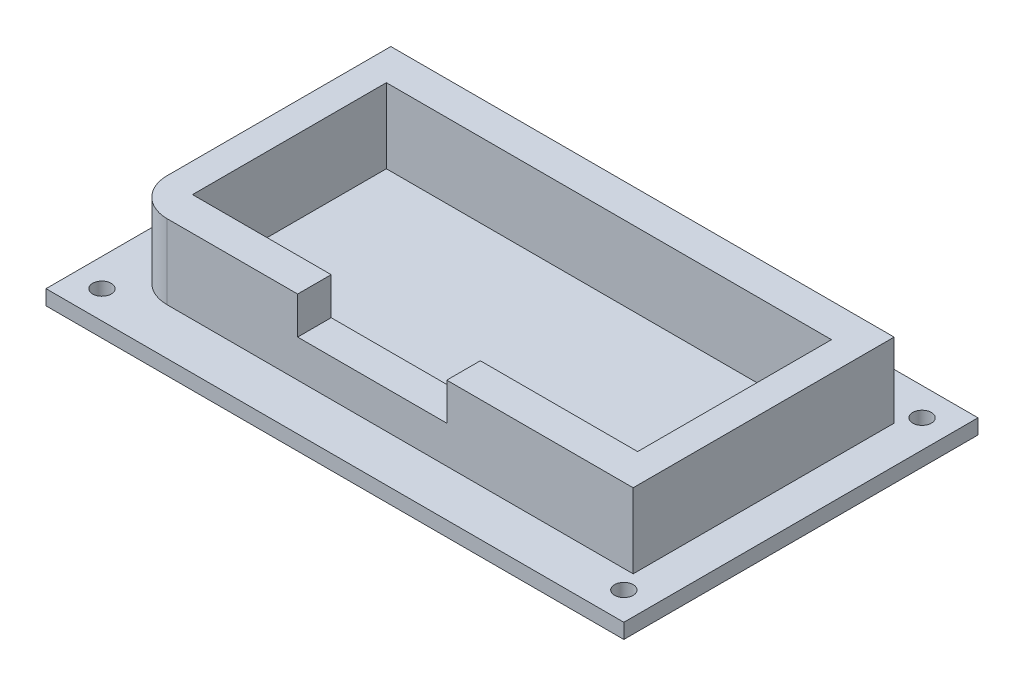
ISO-10303-21;
HEADER;
FILE_DESCRIPTION(('STEP AP214'),'2;1');
FILE_NAME('part.step','',(''),(''),'','','');
FILE_SCHEMA(('AUTOMOTIVE_DESIGN { 1 0 10303 214 1 1 1 1 }'));
ENDSEC;
DATA;
#1=APPLICATION_CONTEXT('core data for automotive mechanical design processes');
#2=APPLICATION_PROTOCOL_DEFINITION('international standard','automotive_design',2000,#1);
#3=PRODUCT_CONTEXT('',#1,'mechanical');
#4=PRODUCT('Part','Part','',(#3));
#5=PRODUCT_RELATED_PRODUCT_CATEGORY('part','',(#4));
#6=PRODUCT_DEFINITION_FORMATION('','',#4);
#7=PRODUCT_DEFINITION_CONTEXT('part definition',#1,'design');
#8=PRODUCT_DEFINITION('design','',#6,#7);
#9=PRODUCT_DEFINITION_SHAPE('','',#8);
#10=(LENGTH_UNIT() NAMED_UNIT(*) SI_UNIT(.MILLI.,.METRE.));
#11=(NAMED_UNIT(*) PLANE_ANGLE_UNIT() SI_UNIT($,.RADIAN.));
#12=(NAMED_UNIT(*) SI_UNIT($,.STERADIAN.) SOLID_ANGLE_UNIT());
#13=UNCERTAINTY_MEASURE_WITH_UNIT(LENGTH_MEASURE(1.E-05),#10,'distance_accuracy_value','');
#14=(GEOMETRIC_REPRESENTATION_CONTEXT(3) GLOBAL_UNCERTAINTY_ASSIGNED_CONTEXT((#13)) GLOBAL_UNIT_ASSIGNED_CONTEXT((#10,
#11,#12)) REPRESENTATION_CONTEXT('',''));
#15=CARTESIAN_POINT('',(0.,0.,0.));
#16=DIRECTION('',(0.,0.,1.));
#17=DIRECTION('',(1.,0.,0.));
#18=AXIS2_PLACEMENT_3D('',#15,#16,#17);
#19=CARTESIAN_POINT('',(-73.025,30.48,31.75));
#20=DIRECTION('',(0.,-1.,0.));
#21=DIRECTION('',(0.,0.,-1.));
#22=AXIS2_PLACEMENT_3D('',#19,#20,#21);
#23=CYLINDRICAL_SURFACE('',#22,12.7);
#24=DIRECTION('',(0.,-1.,0.));
#25=VECTOR('',#24,1.);
#26=CARTESIAN_POINT('',(-73.025,30.48,44.45));
#27=LINE('',#26,#25);
#28=CARTESIAN_POINT('',(-73.025,30.48,44.45));
#29=VERTEX_POINT('',#28);
#30=CARTESIAN_POINT('',(-73.025,5.08,44.45));
#31=VERTEX_POINT('',#30);
#32=EDGE_CURVE('E257',#29,#31,#27,.T.);
#33=ORIENTED_EDGE('',*,*,#32,.F.);
#34=CARTESIAN_POINT('',(-73.025,30.48,31.75));
#35=DIRECTION('',(0.,-1.,0.));
#36=DIRECTION('',(0.,0.,-1.));
#37=AXIS2_PLACEMENT_3D('',#34,#35,#36);
#38=CIRCLE('',#37,12.7);
#39=CARTESIAN_POINT('',(-85.725,30.48,31.75));
#40=VERTEX_POINT('',#39);
#41=EDGE_CURVE('E40',#40,#29,#38,.F.);
#42=ORIENTED_EDGE('',*,*,#41,.F.);
#43=DIRECTION('',(0.,-1.,0.));
#44=VECTOR('',#43,1.);
#45=CARTESIAN_POINT('',(-85.725,30.48,31.75));
#46=LINE('',#45,#44);
#47=CARTESIAN_POINT('',(-85.725,5.08,31.75));
#48=VERTEX_POINT('',#47);
#49=EDGE_CURVE('E259',#48,#40,#46,.F.);
#50=ORIENTED_EDGE('',*,*,#49,.F.);
#51=CARTESIAN_POINT('',(-73.025,5.08,31.75));
#52=DIRECTION('',(0.,1.,0.));
#53=DIRECTION('',(0.,0.,1.));
#54=AXIS2_PLACEMENT_3D('',#51,#52,#53);
#55=CIRCLE('',#54,12.7);
#56=EDGE_CURVE('E11',#48,#31,#55,.T.);
#57=ORIENTED_EDGE('',*,*,#56,.T.);
#58=EDGE_LOOP('',(#33,#42,#50,#57));
#59=FACE_BOUND('',#58,.T.);
#60=ADVANCED_FACE('F33',(#59),#23,.T.);
#61=CARTESIAN_POINT('',(0.,5.08,0.));
#62=DIRECTION('',(0.,1.,0.));
#63=DIRECTION('',(0.,0.,1.));
#64=AXIS2_PLACEMENT_3D('',#61,#62,#63);
#65=PLANE('',#64);
#66=DIRECTION('',(0.,0.,-1.));
#67=VECTOR('',#66,1.);
#68=CARTESIAN_POINT('',(-98.425,5.08,0.));
#69=LINE('',#68,#67);
#70=CARTESIAN_POINT('',(-98.425,5.08,60.325));
#71=VERTEX_POINT('',#70);
#72=CARTESIAN_POINT('',(-98.425,5.08,-60.325));
#73=VERTEX_POINT('',#72);
#74=EDGE_CURVE('E215',#71,#73,#69,.T.);
#75=ORIENTED_EDGE('',*,*,#74,.F.);
#76=DIRECTION('',(-1.,0.,0.));
#77=VECTOR('',#76,1.);
#78=CARTESIAN_POINT('',(0.,5.08,60.325));
#79=LINE('',#78,#77);
#80=CARTESIAN_POINT('',(98.425,5.08,60.325));
#81=VERTEX_POINT('',#80);
#82=EDGE_CURVE('E218',#81,#71,#79,.T.);
#83=ORIENTED_EDGE('',*,*,#82,.F.);
#84=DIRECTION('',(0.,0.,-1.));
#85=VECTOR('',#84,1.);
#86=CARTESIAN_POINT('',(98.425,5.08,0.));
#87=LINE('',#86,#85);
#88=CARTESIAN_POINT('',(98.425,5.08,-60.325));
#89=VERTEX_POINT('',#88);
#90=EDGE_CURVE('E221',#81,#89,#87,.T.);
#91=ORIENTED_EDGE('',*,*,#90,.T.);
#92=DIRECTION('',(-1.,0.,0.));
#93=VECTOR('',#92,1.);
#94=CARTESIAN_POINT('',(0.,5.08,-60.325));
#95=LINE('',#94,#93);
#96=EDGE_CURVE('E224',#89,#73,#95,.T.);
#97=ORIENTED_EDGE('',*,*,#96,.T.);
#98=EDGE_LOOP('',(#75,#83,#91,#97));
#99=FACE_BOUND('',#98,.T.);
#100=CARTESIAN_POINT('',(88.9,5.08,50.8));
#101=DIRECTION('',(0.,1.,0.));
#102=DIRECTION('',(0.,0.,1.));
#103=AXIS2_PLACEMENT_3D('',#100,#101,#102);
#104=CIRCLE('',#103,3.17500000000002);
#105=CARTESIAN_POINT('',(88.9,5.08,53.975));
#106=VERTEX_POINT('',#105);
#107=EDGE_CURVE('E212',#106,#106,#104,.F.);
#108=ORIENTED_EDGE('',*,*,#107,.T.);
#109=EDGE_LOOP('',(#108));
#110=FACE_BOUND('',#109,.T.);
#111=CARTESIAN_POINT('',(-88.9,5.08,-50.8));
#112=DIRECTION('',(0.,1.,0.));
#113=DIRECTION('',(0.,0.,1.));
#114=AXIS2_PLACEMENT_3D('',#111,#112,#113);
#115=CIRCLE('',#114,3.175);
#116=CARTESIAN_POINT('',(-88.9,5.08,-47.625));
#117=VERTEX_POINT('',#116);
#118=EDGE_CURVE('E209',#117,#117,#115,.F.);
#119=ORIENTED_EDGE('',*,*,#118,.T.);
#120=EDGE_LOOP('',(#119));
#121=FACE_BOUND('',#120,.T.);
#122=CARTESIAN_POINT('',(-88.9,5.08,50.8));
#123=DIRECTION('',(0.,1.,0.));
#124=DIRECTION('',(0.,0.,1.));
#125=AXIS2_PLACEMENT_3D('',#122,#123,#124);
#126=CIRCLE('',#125,3.175);
#127=CARTESIAN_POINT('',(-88.9,5.08,53.975));
#128=VERTEX_POINT('',#127);
#129=EDGE_CURVE('E205',#128,#128,#126,.T.);
#130=ORIENTED_EDGE('',*,*,#129,.F.);
#131=EDGE_LOOP('',(#130));
#132=FACE_BOUND('',#131,.T.);
#133=CARTESIAN_POINT('',(88.9,5.08,-50.8));
#134=DIRECTION('',(0.,1.,0.));
#135=DIRECTION('',(0.,0.,1.));
#136=AXIS2_PLACEMENT_3D('',#133,#134,#135);
#137=CIRCLE('',#136,3.175);
#138=CARTESIAN_POINT('',(88.9,5.08,-47.625));
#139=VERTEX_POINT('',#138);
#140=EDGE_CURVE('E202',#139,#139,#137,.T.);
#141=ORIENTED_EDGE('',*,*,#140,.F.);
#142=EDGE_LOOP('',(#141));
#143=FACE_BOUND('',#142,.T.);
#144=DIRECTION('',(-1.,0.,0.));
#145=VECTOR('',#144,1.);
#146=CARTESIAN_POINT('',(-85.725,5.08,-44.45));
#147=LINE('',#146,#145);
#148=CARTESIAN_POINT('',(85.725,5.08,-44.45));
#149=VERTEX_POINT('',#148);
#150=CARTESIAN_POINT('',(-85.725,5.08,-44.45));
#151=VERTEX_POINT('',#150);
#152=EDGE_CURVE('E188',#149,#151,#147,.T.);
#153=ORIENTED_EDGE('',*,*,#152,.F.);
#154=DIRECTION('',(0.,0.,-1.));
#155=VECTOR('',#154,1.);
#156=CARTESIAN_POINT('',(85.725,5.08,44.45));
#157=LINE('',#156,#155);
#158=CARTESIAN_POINT('',(85.725,5.08,44.45));
#159=VERTEX_POINT('',#158);
#160=EDGE_CURVE('E185',#159,#149,#157,.T.);
#161=ORIENTED_EDGE('',*,*,#160,.F.);
#162=DIRECTION('',(1.,0.,0.));
#163=VECTOR('',#162,1.);
#164=CARTESIAN_POINT('',(-85.725,5.08,44.45));
#165=LINE('',#164,#163);
#166=EDGE_CURVE('E194',#31,#159,#165,.T.);
#167=ORIENTED_EDGE('',*,*,#166,.F.);
#168=ORIENTED_EDGE('',*,*,#56,.F.);
#169=DIRECTION('',(0.,0.,1.));
#170=VECTOR('',#169,1.);
#171=CARTESIAN_POINT('',(-85.725,5.08,44.45));
#172=LINE('',#171,#170);
#173=EDGE_CURVE('E191',#151,#48,#172,.T.);
#174=ORIENTED_EDGE('',*,*,#173,.F.);
#175=EDGE_LOOP('',(#153,#161,#167,#168,#174));
#176=FACE_BOUND('',#175,.T.);
#177=ADVANCED_FACE('F325',(#99,#110,#121,#132,#143,#176),#65,.T.);
#178=CARTESIAN_POINT('',(-98.425,5.08,0.));
#179=DIRECTION('',(-1.,0.,0.));
#180=DIRECTION('',(0.,0.,1.));
#181=AXIS2_PLACEMENT_3D('',#178,#179,#180);
#182=PLANE('',#181);
#183=DIRECTION('',(0.,0.,-1.));
#184=VECTOR('',#183,1.);
#185=CARTESIAN_POINT('',(-98.425,0.,0.));
#186=LINE('',#185,#184);
#187=CARTESIAN_POINT('',(-98.425,0.,60.325));
#188=VERTEX_POINT('',#187);
#189=CARTESIAN_POINT('',(-98.425,0.,-60.325));
#190=VERTEX_POINT('',#189);
#191=EDGE_CURVE('E238',#188,#190,#186,.T.);
#192=ORIENTED_EDGE('',*,*,#191,.F.);
#193=DIRECTION('',(0.,-1.,0.));
#194=VECTOR('',#193,1.);
#195=CARTESIAN_POINT('',(-98.425,5.08,60.325));
#196=LINE('',#195,#194);
#197=EDGE_CURVE('E255',#71,#188,#196,.T.);
#198=ORIENTED_EDGE('',*,*,#197,.F.);
#199=ORIENTED_EDGE('',*,*,#74,.T.);
#200=DIRECTION('',(0.,-1.,0.));
#201=VECTOR('',#200,1.);
#202=CARTESIAN_POINT('',(-98.425,5.08,-60.325));
#203=LINE('',#202,#201);
#204=EDGE_CURVE('E226',#73,#190,#203,.T.);
#205=ORIENTED_EDGE('',*,*,#204,.T.);
#206=EDGE_LOOP('',(#192,#198,#199,#205));
#207=FACE_BOUND('',#206,.T.);
#208=ADVANCED_FACE('F330',(#207),#182,.T.);
#209=CARTESIAN_POINT('',(0.,5.08,60.325));
#210=DIRECTION('',(0.,0.,1.));
#211=DIRECTION('',(1.,0.,0.));
#212=AXIS2_PLACEMENT_3D('',#209,#210,#211);
#213=PLANE('',#212);
#214=DIRECTION('',(-1.,0.,0.));
#215=VECTOR('',#214,1.);
#216=CARTESIAN_POINT('',(0.,0.,60.325));
#217=LINE('',#216,#215);
#218=CARTESIAN_POINT('',(98.425,0.,60.325));
#219=VERTEX_POINT('',#218);
#220=EDGE_CURVE('E241',#219,#188,#217,.T.);
#221=ORIENTED_EDGE('',*,*,#220,.F.);
#222=DIRECTION('',(0.,-1.,0.));
#223=VECTOR('',#222,1.);
#224=CARTESIAN_POINT('',(98.425,5.08,60.325));
#225=LINE('',#224,#223);
#226=EDGE_CURVE('E253',#81,#219,#225,.T.);
#227=ORIENTED_EDGE('',*,*,#226,.F.);
#228=ORIENTED_EDGE('',*,*,#82,.T.);
#229=ORIENTED_EDGE('',*,*,#197,.T.);
#230=EDGE_LOOP('',(#221,#227,#228,#229));
#231=FACE_BOUND('',#230,.T.);
#232=ADVANCED_FACE('F337',(#231),#213,.T.);
#233=CARTESIAN_POINT('',(98.425,5.08,0.));
#234=DIRECTION('',(-1.,0.,0.));
#235=DIRECTION('',(0.,0.,1.));
#236=AXIS2_PLACEMENT_3D('',#233,#234,#235);
#237=PLANE('',#236);
#238=DIRECTION('',(0.,0.,-1.));
#239=VECTOR('',#238,1.);
#240=CARTESIAN_POINT('',(98.425,0.,0.));
#241=LINE('',#240,#239);
#242=CARTESIAN_POINT('',(98.425,0.,-60.325));
#243=VERTEX_POINT('',#242);
#244=EDGE_CURVE('E244',#219,#243,#241,.T.);
#245=ORIENTED_EDGE('',*,*,#244,.T.);
#246=DIRECTION('',(0.,-1.,0.));
#247=VECTOR('',#246,1.);
#248=CARTESIAN_POINT('',(98.425,5.08,-60.325));
#249=LINE('',#248,#247);
#250=EDGE_CURVE('E250',#89,#243,#249,.T.);
#251=ORIENTED_EDGE('',*,*,#250,.F.);
#252=ORIENTED_EDGE('',*,*,#90,.F.);
#253=ORIENTED_EDGE('',*,*,#226,.T.);
#254=EDGE_LOOP('',(#245,#251,#252,#253));
#255=FACE_BOUND('',#254,.T.);
#256=ADVANCED_FACE('F522',(#255),#237,.F.);
#257=CARTESIAN_POINT('',(88.9,5.08,50.8));
#258=DIRECTION('',(0.,-1.,0.));
#259=DIRECTION('',(0.,0.,-1.));
#260=AXIS2_PLACEMENT_3D('',#257,#258,#259);
#261=CYLINDRICAL_SURFACE('',#260,3.17500000000002);
#262=ORIENTED_EDGE('',*,*,#107,.F.);
#263=EDGE_LOOP('',(#262));
#264=FACE_BOUND('',#263,.T.);
#265=CARTESIAN_POINT('',(88.9,0.,50.8));
#266=DIRECTION('',(0.,1.,0.));
#267=DIRECTION('',(0.,0.,1.));
#268=AXIS2_PLACEMENT_3D('',#265,#266,#267);
#269=CIRCLE('',#268,3.17500000000002);
#270=CARTESIAN_POINT('',(88.9,0.,53.975));
#271=VERTEX_POINT('',#270);
#272=EDGE_CURVE('E235',#271,#271,#269,.F.);
#273=ORIENTED_EDGE('',*,*,#272,.T.);
#274=EDGE_LOOP('',(#273));
#275=FACE_BOUND('',#274,.T.);
#276=ADVANCED_FACE('F512',(#264,#275),#261,.F.);
#277=CARTESIAN_POINT('',(-88.9,5.08,-50.8));
#278=DIRECTION('',(0.,-1.,0.));
#279=DIRECTION('',(0.,0.,-1.));
#280=AXIS2_PLACEMENT_3D('',#277,#278,#279);
#281=CYLINDRICAL_SURFACE('',#280,3.175);
#282=ORIENTED_EDGE('',*,*,#118,.F.);
#283=EDGE_LOOP('',(#282));
#284=FACE_BOUND('',#283,.T.);
#285=CARTESIAN_POINT('',(-88.9,0.,-50.8));
#286=DIRECTION('',(0.,1.,0.));
#287=DIRECTION('',(0.,0.,1.));
#288=AXIS2_PLACEMENT_3D('',#285,#286,#287);
#289=CIRCLE('',#288,3.175);
#290=CARTESIAN_POINT('',(-88.9,0.,-47.625));
#291=VERTEX_POINT('',#290);
#292=EDGE_CURVE('E232',#291,#291,#289,.F.);
#293=ORIENTED_EDGE('',*,*,#292,.T.);
#294=EDGE_LOOP('',(#293));
#295=FACE_BOUND('',#294,.T.);
#296=ADVANCED_FACE('F502',(#284,#295),#281,.F.);
#297=CARTESIAN_POINT('',(-88.9,5.08,50.8));
#298=DIRECTION('',(0.,-1.,0.));
#299=DIRECTION('',(0.,0.,-1.));
#300=AXIS2_PLACEMENT_3D('',#297,#298,#299);
#301=CYLINDRICAL_SURFACE('',#300,3.175);
#302=ORIENTED_EDGE('',*,*,#129,.T.);
#303=EDGE_LOOP('',(#302));
#304=FACE_BOUND('',#303,.T.);
#305=CARTESIAN_POINT('',(-88.9,0.,50.8));
#306=DIRECTION('',(0.,1.,0.));
#307=DIRECTION('',(0.,0.,1.));
#308=AXIS2_PLACEMENT_3D('',#305,#306,#307);
#309=CIRCLE('',#308,3.175);
#310=CARTESIAN_POINT('',(-88.9,0.,53.975));
#311=VERTEX_POINT('',#310);
#312=EDGE_CURVE('E229',#311,#311,#309,.T.);
#313=ORIENTED_EDGE('',*,*,#312,.F.);
#314=EDGE_LOOP('',(#313));
#315=FACE_BOUND('',#314,.T.);
#316=ADVANCED_FACE('F493',(#304,#315),#301,.F.);
#317=CARTESIAN_POINT('',(88.9,5.08,-50.8));
#318=DIRECTION('',(0.,-1.,0.));
#319=DIRECTION('',(0.,0.,-1.));
#320=AXIS2_PLACEMENT_3D('',#317,#318,#319);
#321=CYLINDRICAL_SURFACE('',#320,3.175);
#322=ORIENTED_EDGE('',*,*,#140,.T.);
#323=EDGE_LOOP('',(#322));
#324=FACE_BOUND('',#323,.T.);
#325=CARTESIAN_POINT('',(88.9,0.,-50.8));
#326=DIRECTION('',(0.,1.,0.));
#327=DIRECTION('',(0.,0.,1.));
#328=AXIS2_PLACEMENT_3D('',#325,#326,#327);
#329=CIRCLE('',#328,3.175);
#330=CARTESIAN_POINT('',(88.9,0.,-47.625));
#331=VERTEX_POINT('',#330);
#332=EDGE_CURVE('E201',#331,#331,#329,.T.);
#333=ORIENTED_EDGE('',*,*,#332,.F.);
#334=EDGE_LOOP('',(#333));
#335=FACE_BOUND('',#334,.T.);
#336=ADVANCED_FACE('F483',(#324,#335),#321,.F.);
#337=CARTESIAN_POINT('',(0.,5.08,-60.325));
#338=DIRECTION('',(0.,0.,1.));
#339=DIRECTION('',(1.,0.,0.));
#340=AXIS2_PLACEMENT_3D('',#337,#338,#339);
#341=PLANE('',#340);
#342=DIRECTION('',(-1.,0.,0.));
#343=VECTOR('',#342,1.);
#344=CARTESIAN_POINT('',(0.,0.,-60.325));
#345=LINE('',#344,#343);
#346=EDGE_CURVE('E206',#243,#190,#345,.T.);
#347=ORIENTED_EDGE('',*,*,#346,.T.);
#348=ORIENTED_EDGE('',*,*,#204,.F.);
#349=ORIENTED_EDGE('',*,*,#96,.F.);
#350=ORIENTED_EDGE('',*,*,#250,.T.);
#351=EDGE_LOOP('',(#347,#348,#349,#350));
#352=FACE_BOUND('',#351,.T.);
#353=ADVANCED_FACE('F472',(#352),#341,.F.);
#354=CARTESIAN_POINT('',(0.,0.,0.));
#355=DIRECTION('',(0.,1.,0.));
#356=DIRECTION('',(0.,0.,1.));
#357=AXIS2_PLACEMENT_3D('',#354,#355,#356);
#358=PLANE('',#357);
#359=ORIENTED_EDGE('',*,*,#332,.T.);
#360=EDGE_LOOP('',(#359));
#361=FACE_BOUND('',#360,.T.);
#362=ORIENTED_EDGE('',*,*,#312,.T.);
#363=EDGE_LOOP('',(#362));
#364=FACE_BOUND('',#363,.T.);
#365=ORIENTED_EDGE('',*,*,#292,.F.);
#366=EDGE_LOOP('',(#365));
#367=FACE_BOUND('',#366,.T.);
#368=ORIENTED_EDGE('',*,*,#272,.F.);
#369=EDGE_LOOP('',(#368));
#370=FACE_BOUND('',#369,.T.);
#371=ORIENTED_EDGE('',*,*,#191,.T.);
#372=ORIENTED_EDGE('',*,*,#346,.F.);
#373=ORIENTED_EDGE('',*,*,#244,.F.);
#374=ORIENTED_EDGE('',*,*,#220,.T.);
#375=EDGE_LOOP('',(#371,#372,#373,#374));
#376=FACE_BOUND('',#375,.T.);
#377=ADVANCED_FACE('F387',(#361,#364,#367,#370,#376),#358,.F.);
#378=CARTESIAN_POINT('',(0.,30.48,0.));
#379=DIRECTION('',(0.,-1.,0.));
#380=DIRECTION('',(0.,0.,-1.));
#381=AXIS2_PLACEMENT_3D('',#378,#379,#380);
#382=PLANE('',#381);
#383=DIRECTION('',(1.,0.,0.));
#384=VECTOR('',#383,1.);
#385=CARTESIAN_POINT('',(-85.725,30.48,44.45));
#386=LINE('',#385,#384);
#387=CARTESIAN_POINT('',(-28.5769865469619,30.48,44.45));
#388=VERTEX_POINT('',#387);
#389=EDGE_CURVE('E168',#29,#388,#386,.T.);
#390=ORIENTED_EDGE('',*,*,#389,.T.);
#391=DIRECTION('',(0.,0.,-1.));
#392=VECTOR('',#391,1.);
#393=CARTESIAN_POINT('',(-28.5769865469619,30.48,60.326));
#394=LINE('',#393,#392);
#395=CARTESIAN_POINT('',(-28.5769865469619,30.48,33.02));
#396=VERTEX_POINT('',#395);
#397=EDGE_CURVE('E151',#388,#396,#394,.T.);
#398=ORIENTED_EDGE('',*,*,#397,.T.);
#399=DIRECTION('',(1.,0.,0.));
#400=VECTOR('',#399,1.);
#401=CARTESIAN_POINT('',(75.819,30.48,33.02));
#402=LINE('',#401,#400);
#403=CARTESIAN_POINT('',(-75.819,30.48,33.02));
#404=VERTEX_POINT('',#403);
#405=EDGE_CURVE('E295',#404,#396,#402,.T.);
#406=ORIENTED_EDGE('',*,*,#405,.F.);
#407=DIRECTION('',(0.,0.,1.));
#408=VECTOR('',#407,1.);
#409=CARTESIAN_POINT('',(-75.819,30.48,33.02));
#410=LINE('',#409,#408);
#411=CARTESIAN_POINT('',(-75.819,30.48,-33.02));
#412=VERTEX_POINT('',#411);
#413=EDGE_CURVE('E283',#412,#404,#410,.T.);
#414=ORIENTED_EDGE('',*,*,#413,.F.);
#415=DIRECTION('',(-1.,0.,0.));
#416=VECTOR('',#415,1.);
#417=CARTESIAN_POINT('',(75.819,30.48,-33.02));
#418=LINE('',#417,#416);
#419=CARTESIAN_POINT('',(75.819,30.48,-33.02));
#420=VERTEX_POINT('',#419);
#421=EDGE_CURVE('E280',#420,#412,#418,.T.);
#422=ORIENTED_EDGE('',*,*,#421,.F.);
#423=DIRECTION('',(0.,0.,-1.));
#424=VECTOR('',#423,1.);
#425=CARTESIAN_POINT('',(75.819,30.48,33.02));
#426=LINE('',#425,#424);
#427=CARTESIAN_POINT('',(75.819,30.48,33.02));
#428=VERTEX_POINT('',#427);
#429=EDGE_CURVE('E292',#428,#420,#426,.T.);
#430=ORIENTED_EDGE('',*,*,#429,.F.);
#431=CARTESIAN_POINT('',(22.2230134530381,30.48,33.02));
#432=VERTEX_POINT('',#431);
#433=EDGE_CURVE('E297',#432,#428,#402,.T.);
#434=ORIENTED_EDGE('',*,*,#433,.F.);
#435=DIRECTION('',(0.,0.,-1.));
#436=VECTOR('',#435,1.);
#437=CARTESIAN_POINT('',(22.2230134530381,30.48,60.326));
#438=LINE('',#437,#436);
#439=CARTESIAN_POINT('',(22.2230134530381,30.48,44.45));
#440=VERTEX_POINT('',#439);
#441=EDGE_CURVE('E47',#440,#432,#438,.T.);
#442=ORIENTED_EDGE('',*,*,#441,.F.);
#443=CARTESIAN_POINT('',(85.725,30.48,44.45));
#444=VERTEX_POINT('',#443);
#445=EDGE_CURVE('E176',#440,#444,#386,.T.);
#446=ORIENTED_EDGE('',*,*,#445,.T.);
#447=DIRECTION('',(0.,0.,-1.));
#448=VECTOR('',#447,1.);
#449=CARTESIAN_POINT('',(85.725,30.48,44.45));
#450=LINE('',#449,#448);
#451=CARTESIAN_POINT('',(85.725,30.48,-44.45));
#452=VERTEX_POINT('',#451);
#453=EDGE_CURVE('E195',#444,#452,#450,.T.);
#454=ORIENTED_EDGE('',*,*,#453,.T.);
#455=DIRECTION('',(-1.,0.,0.));
#456=VECTOR('',#455,1.);
#457=CARTESIAN_POINT('',(-85.725,30.48,-44.45));
#458=LINE('',#457,#456);
#459=CARTESIAN_POINT('',(-85.725,30.48,-44.45));
#460=VERTEX_POINT('',#459);
#461=EDGE_CURVE('E265',#452,#460,#458,.T.);
#462=ORIENTED_EDGE('',*,*,#461,.T.);
#463=DIRECTION('',(0.,0.,1.));
#464=VECTOR('',#463,1.);
#465=CARTESIAN_POINT('',(-85.725,30.48,44.45));
#466=LINE('',#465,#464);
#467=EDGE_CURVE('E181',#460,#40,#466,.T.);
#468=ORIENTED_EDGE('',*,*,#467,.T.);
#469=ORIENTED_EDGE('',*,*,#41,.T.);
#470=EDGE_LOOP('',(#390,#398,#406,#414,#422,#430,#434,#442,#446,#454,#462,#468,#469));
#471=FACE_BOUND('',#470,.T.);
#472=ADVANCED_FACE('F173',(#471),#382,.F.);
#473=CARTESIAN_POINT('',(85.725,30.48,44.45));
#474=DIRECTION('',(-1.,0.,0.));
#475=DIRECTION('',(0.,0.,1.));
#476=AXIS2_PLACEMENT_3D('',#473,#474,#475);
#477=PLANE('',#476);
#478=ORIENTED_EDGE('',*,*,#160,.T.);
#479=DIRECTION('',(0.,-1.,0.));
#480=VECTOR('',#479,1.);
#481=CARTESIAN_POINT('',(85.725,30.48,-44.45));
#482=LINE('',#481,#480);
#483=EDGE_CURVE('E199',#452,#149,#482,.T.);
#484=ORIENTED_EDGE('',*,*,#483,.F.);
#485=ORIENTED_EDGE('',*,*,#453,.F.);
#486=DIRECTION('',(0.,-1.,0.));
#487=VECTOR('',#486,1.);
#488=CARTESIAN_POINT('',(85.725,30.48,44.45));
#489=LINE('',#488,#487);
#490=EDGE_CURVE('E175',#444,#159,#489,.T.);
#491=ORIENTED_EDGE('',*,*,#490,.T.);
#492=EDGE_LOOP('',(#478,#484,#485,#491));
#493=FACE_BOUND('',#492,.T.);
#494=ADVANCED_FACE('F320',(#493),#477,.F.);
#495=CARTESIAN_POINT('',(-85.725,30.48,-44.45));
#496=DIRECTION('',(0.,0.,1.));
#497=DIRECTION('',(1.,0.,0.));
#498=AXIS2_PLACEMENT_3D('',#495,#496,#497);
#499=PLANE('',#498);
#500=ORIENTED_EDGE('',*,*,#152,.T.);
#501=DIRECTION('',(0.,-1.,0.));
#502=VECTOR('',#501,1.);
#503=CARTESIAN_POINT('',(-85.725,30.48,-44.45));
#504=LINE('',#503,#502);
#505=EDGE_CURVE('E179',#460,#151,#504,.T.);
#506=ORIENTED_EDGE('',*,*,#505,.F.);
#507=ORIENTED_EDGE('',*,*,#461,.F.);
#508=ORIENTED_EDGE('',*,*,#483,.T.);
#509=EDGE_LOOP('',(#500,#506,#507,#508));
#510=FACE_BOUND('',#509,.T.);
#511=ADVANCED_FACE('F323',(#510),#499,.F.);
#512=CARTESIAN_POINT('',(-85.725,30.48,44.45));
#513=DIRECTION('',(1.,0.,0.));
#514=DIRECTION('',(0.,0.,-1.));
#515=AXIS2_PLACEMENT_3D('',#512,#513,#514);
#516=PLANE('',#515);
#517=ORIENTED_EDGE('',*,*,#173,.T.);
#518=ORIENTED_EDGE('',*,*,#49,.T.);
#519=ORIENTED_EDGE('',*,*,#467,.F.);
#520=ORIENTED_EDGE('',*,*,#505,.T.);
#521=EDGE_LOOP('',(#517,#518,#519,#520));
#522=FACE_BOUND('',#521,.T.);
#523=ADVANCED_FACE('F262',(#522),#516,.F.);
#524=CARTESIAN_POINT('',(-85.725,30.48,44.45));
#525=DIRECTION('',(0.,0.,-1.));
#526=DIRECTION('',(-1.,0.,0.));
#527=AXIS2_PLACEMENT_3D('',#524,#525,#526);
#528=PLANE('',#527);
#529=DIRECTION('',(1.,0.,0.));
#530=VECTOR('',#529,1.);
#531=CARTESIAN_POINT('',(-28.5769865469619,17.78,44.45));
#532=LINE('',#531,#530);
#533=CARTESIAN_POINT('',(-28.5769865469619,17.78,44.45));
#534=VERTEX_POINT('',#533);
#535=CARTESIAN_POINT('',(22.2230134530381,17.78,44.45));
#536=VERTEX_POINT('',#535);
#537=EDGE_CURVE('E171',#534,#536,#532,.T.);
#538=ORIENTED_EDGE('',*,*,#537,.F.);
#539=DIRECTION('',(0.,-1.,0.));
#540=VECTOR('',#539,1.);
#541=CARTESIAN_POINT('',(-28.5769865469619,30.48,44.45));
#542=LINE('',#541,#540);
#543=EDGE_CURVE('E154',#388,#534,#542,.T.);
#544=ORIENTED_EDGE('',*,*,#543,.F.);
#545=ORIENTED_EDGE('',*,*,#389,.F.);
#546=ORIENTED_EDGE('',*,*,#32,.T.);
#547=ORIENTED_EDGE('',*,*,#166,.T.);
#548=ORIENTED_EDGE('',*,*,#490,.F.);
#549=ORIENTED_EDGE('',*,*,#445,.F.);
#550=DIRECTION('',(0.,1.,0.));
#551=VECTOR('',#550,1.);
#552=CARTESIAN_POINT('',(22.2230134530381,30.48,44.45));
#553=LINE('',#552,#551);
#554=EDGE_CURVE('E309',#536,#440,#553,.T.);
#555=ORIENTED_EDGE('',*,*,#554,.F.);
#556=EDGE_LOOP('',(#538,#544,#545,#546,#547,#548,#549,#555));
#557=FACE_BOUND('',#556,.T.);
#558=ADVANCED_FACE('F166',(#557),#528,.F.);
#559=CARTESIAN_POINT('',(-75.819,30.48,33.02));
#560=DIRECTION('',(1.,0.,0.));
#561=DIRECTION('',(0.,0.,-1.));
#562=AXIS2_PLACEMENT_3D('',#559,#560,#561);
#563=PLANE('',#562);
#564=DIRECTION('',(0.,0.,1.));
#565=VECTOR('',#564,1.);
#566=CARTESIAN_POINT('',(-75.819,5.08,33.02));
#567=LINE('',#566,#565);
#568=CARTESIAN_POINT('',(-75.819,5.08,-33.02));
#569=VERTEX_POINT('',#568);
#570=CARTESIAN_POINT('',(-75.819,5.08,33.02));
#571=VERTEX_POINT('',#570);
#572=EDGE_CURVE('E288',#569,#571,#567,.T.);
#573=ORIENTED_EDGE('',*,*,#572,.F.);
#574=DIRECTION('',(0.,-1.,0.));
#575=VECTOR('',#574,1.);
#576=CARTESIAN_POINT('',(-75.819,30.48,-33.02));
#577=LINE('',#576,#575);
#578=EDGE_CURVE('E277',#412,#569,#577,.T.);
#579=ORIENTED_EDGE('',*,*,#578,.F.);
#580=ORIENTED_EDGE('',*,*,#413,.T.);
#581=DIRECTION('',(0.,-1.,0.));
#582=VECTOR('',#581,1.);
#583=CARTESIAN_POINT('',(-75.819,30.48,33.02));
#584=LINE('',#583,#582);
#585=EDGE_CURVE('E189',#404,#571,#584,.T.);
#586=ORIENTED_EDGE('',*,*,#585,.T.);
#587=EDGE_LOOP('',(#573,#579,#580,#586));
#588=FACE_BOUND('',#587,.T.);
#589=ADVANCED_FACE('F366',(#588),#563,.T.);
#590=CARTESIAN_POINT('',(75.819,30.48,33.02));
#591=DIRECTION('',(0.,0.,-1.));
#592=DIRECTION('',(-1.,0.,0.));
#593=AXIS2_PLACEMENT_3D('',#590,#591,#592);
#594=PLANE('',#593);
#595=DIRECTION('',(0.,1.,0.));
#596=VECTOR('',#595,1.);
#597=CARTESIAN_POINT('',(-28.5769865469619,30.48,33.02));
#598=LINE('',#597,#596);
#599=CARTESIAN_POINT('',(-28.5769865469619,17.78,33.02));
#600=VERTEX_POINT('',#599);
#601=EDGE_CURVE('E157',#600,#396,#598,.T.);
#602=ORIENTED_EDGE('',*,*,#601,.F.);
#603=DIRECTION('',(-1.,0.,0.));
#604=VECTOR('',#603,1.);
#605=CARTESIAN_POINT('',(-28.5769865469619,17.78,33.02));
#606=LINE('',#605,#604);
#607=CARTESIAN_POINT('',(22.2230134530381,17.78,33.02));
#608=VERTEX_POINT('',#607);
#609=EDGE_CURVE('E162',#608,#600,#606,.T.);
#610=ORIENTED_EDGE('',*,*,#609,.F.);
#611=DIRECTION('',(0.,-1.,0.));
#612=VECTOR('',#611,1.);
#613=CARTESIAN_POINT('',(22.2230134530381,30.48,33.02));
#614=LINE('',#613,#612);
#615=EDGE_CURVE('E305',#432,#608,#614,.T.);
#616=ORIENTED_EDGE('',*,*,#615,.F.);
#617=ORIENTED_EDGE('',*,*,#433,.T.);
#618=DIRECTION('',(0.,-1.,0.));
#619=VECTOR('',#618,1.);
#620=CARTESIAN_POINT('',(75.819,30.48,33.02));
#621=LINE('',#620,#619);
#622=CARTESIAN_POINT('',(75.819,5.08,33.02));
#623=VERTEX_POINT('',#622);
#624=EDGE_CURVE('E271',#428,#623,#621,.T.);
#625=ORIENTED_EDGE('',*,*,#624,.T.);
#626=DIRECTION('',(1.,0.,0.));
#627=VECTOR('',#626,1.);
#628=CARTESIAN_POINT('',(75.819,5.08,33.02));
#629=LINE('',#628,#627);
#630=EDGE_CURVE('E286',#571,#623,#629,.T.);
#631=ORIENTED_EDGE('',*,*,#630,.F.);
#632=ORIENTED_EDGE('',*,*,#585,.F.);
#633=ORIENTED_EDGE('',*,*,#405,.T.);
#634=EDGE_LOOP('',(#602,#610,#616,#617,#625,#631,#632,#633));
#635=FACE_BOUND('',#634,.T.);
#636=ADVANCED_FACE('F363',(#635),#594,.T.);
#637=CARTESIAN_POINT('',(75.819,30.48,33.02));
#638=DIRECTION('',(-1.,0.,0.));
#639=DIRECTION('',(0.,0.,1.));
#640=AXIS2_PLACEMENT_3D('',#637,#638,#639);
#641=PLANE('',#640);
#642=DIRECTION('',(0.,0.,-1.));
#643=VECTOR('',#642,1.);
#644=CARTESIAN_POINT('',(75.819,5.08,33.02));
#645=LINE('',#644,#643);
#646=CARTESIAN_POINT('',(75.819,5.08,-33.02));
#647=VERTEX_POINT('',#646);
#648=EDGE_CURVE('E284',#623,#647,#645,.T.);
#649=ORIENTED_EDGE('',*,*,#648,.F.);
#650=ORIENTED_EDGE('',*,*,#624,.F.);
#651=ORIENTED_EDGE('',*,*,#429,.T.);
#652=DIRECTION('',(0.,-1.,0.));
#653=VECTOR('',#652,1.);
#654=CARTESIAN_POINT('',(75.819,30.48,-33.02));
#655=LINE('',#654,#653);
#656=EDGE_CURVE('E274',#420,#647,#655,.T.);
#657=ORIENTED_EDGE('',*,*,#656,.T.);
#658=EDGE_LOOP('',(#649,#650,#651,#657));
#659=FACE_BOUND('',#658,.T.);
#660=ADVANCED_FACE('F353',(#659),#641,.T.);
#661=CARTESIAN_POINT('',(75.819,30.48,-33.02));
#662=DIRECTION('',(0.,0.,1.));
#663=DIRECTION('',(1.,0.,0.));
#664=AXIS2_PLACEMENT_3D('',#661,#662,#663);
#665=PLANE('',#664);
#666=DIRECTION('',(-1.,0.,0.));
#667=VECTOR('',#666,1.);
#668=CARTESIAN_POINT('',(75.819,5.08,-33.02));
#669=LINE('',#668,#667);
#670=EDGE_CURVE('E281',#647,#569,#669,.T.);
#671=ORIENTED_EDGE('',*,*,#670,.F.);
#672=ORIENTED_EDGE('',*,*,#656,.F.);
#673=ORIENTED_EDGE('',*,*,#421,.T.);
#674=ORIENTED_EDGE('',*,*,#578,.T.);
#675=EDGE_LOOP('',(#671,#672,#673,#674));
#676=FACE_BOUND('',#675,.T.);
#677=ADVANCED_FACE('F345',(#676),#665,.T.);
#678=ORIENTED_EDGE('',*,*,#572,.T.);
#679=ORIENTED_EDGE('',*,*,#630,.T.);
#680=ORIENTED_EDGE('',*,*,#648,.T.);
#681=ORIENTED_EDGE('',*,*,#670,.T.);
#682=EDGE_LOOP('',(#678,#679,#680,#681));
#683=FACE_BOUND('',#682,.T.);
#684=ADVANCED_FACE('F333',(#683),#65,.T.);
#685=CARTESIAN_POINT('',(-28.5769865469619,30.48,60.326));
#686=DIRECTION('',(-1.,0.,0.));
#687=DIRECTION('',(0.,0.,1.));
#688=AXIS2_PLACEMENT_3D('',#685,#686,#687);
#689=PLANE('',#688);
#690=ORIENTED_EDGE('',*,*,#543,.T.);
#691=DIRECTION('',(0.,0.,-1.));
#692=VECTOR('',#691,1.);
#693=CARTESIAN_POINT('',(-28.5769865469619,17.78,60.326));
#694=LINE('',#693,#692);
#695=EDGE_CURVE('E290',#534,#600,#694,.T.);
#696=ORIENTED_EDGE('',*,*,#695,.T.);
#697=ORIENTED_EDGE('',*,*,#601,.T.);
#698=ORIENTED_EDGE('',*,*,#397,.F.);
#699=EDGE_LOOP('',(#690,#696,#697,#698));
#700=FACE_BOUND('',#699,.T.);
#701=ADVANCED_FACE('F153',(#700),#689,.F.);
#702=CARTESIAN_POINT('',(-28.5769865469619,17.78,60.326));
#703=DIRECTION('',(0.,-1.,0.));
#704=DIRECTION('',(1.,0.,0.));
#705=AXIS2_PLACEMENT_3D('',#702,#703,#704);
#706=PLANE('',#705);
#707=ORIENTED_EDGE('',*,*,#537,.T.);
#708=DIRECTION('',(0.,0.,-1.));
#709=VECTOR('',#708,1.);
#710=CARTESIAN_POINT('',(22.2230134530381,17.78,60.326));
#711=LINE('',#710,#709);
#712=EDGE_CURVE('E300',#536,#608,#711,.T.);
#713=ORIENTED_EDGE('',*,*,#712,.T.);
#714=ORIENTED_EDGE('',*,*,#609,.T.);
#715=ORIENTED_EDGE('',*,*,#695,.F.);
#716=EDGE_LOOP('',(#707,#713,#714,#715));
#717=FACE_BOUND('',#716,.T.);
#718=ADVANCED_FACE('F351',(#717),#706,.F.);
#719=CARTESIAN_POINT('',(22.2230134530381,30.48,60.326));
#720=DIRECTION('',(1.,0.,0.));
#721=DIRECTION('',(0.,1.,0.));
#722=AXIS2_PLACEMENT_3D('',#719,#720,#721);
#723=PLANE('',#722);
#724=ORIENTED_EDGE('',*,*,#554,.T.);
#725=ORIENTED_EDGE('',*,*,#441,.T.);
#726=ORIENTED_EDGE('',*,*,#615,.T.);
#727=ORIENTED_EDGE('',*,*,#712,.F.);
#728=EDGE_LOOP('',(#724,#725,#726,#727));
#729=FACE_BOUND('',#728,.T.);
#730=ADVANCED_FACE('F310',(#729),#723,.F.);
#731=CLOSED_SHELL('',(#60,#177,#208,#232,#256,#276,#296,#316,#336,#353,#377,#472,#494,#511,#523,
#558,#589,#636,#660,#677,#684,#701,#718,#730));
#732=MANIFOLD_SOLID_BREP('B2',#731);
#733=ADVANCED_BREP_SHAPE_REPRESENTATION('',(#18,#732),#14);
#734=SHAPE_DEFINITION_REPRESENTATION(#9,#733);
ENDSEC;
END-ISO-10303-21;
